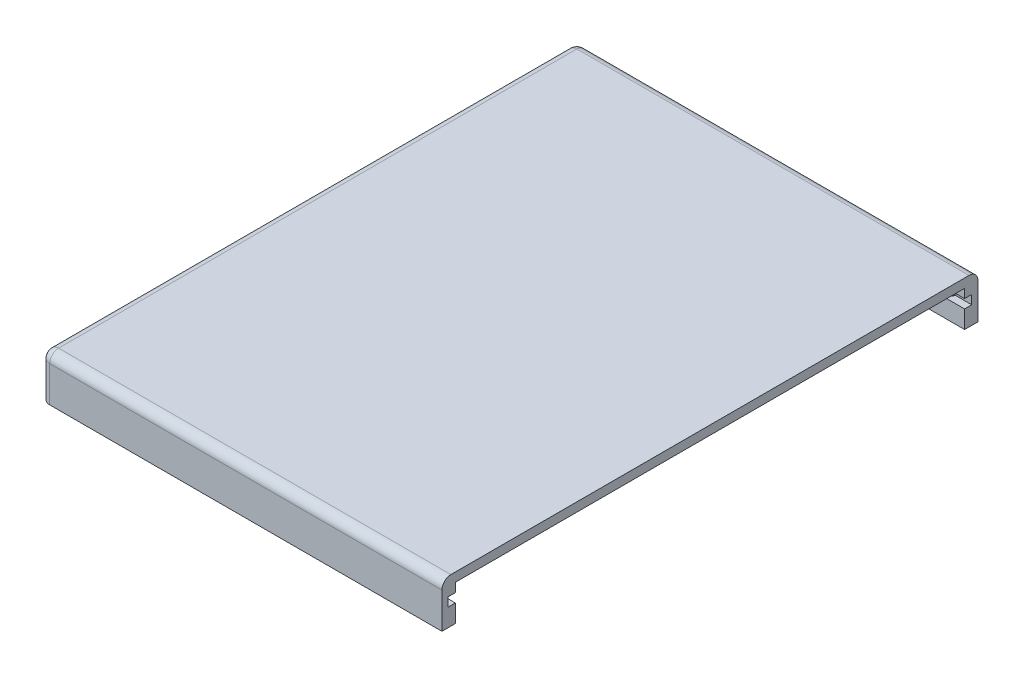
ISO-10303-21;
HEADER;
FILE_DESCRIPTION(('STEP AP214'),'2;1');
FILE_NAME('part.step','',(''),(''),'','','');
FILE_SCHEMA(('AUTOMOTIVE_DESIGN { 1 0 10303 214 1 1 1 1 }'));
ENDSEC;
DATA;
#1=APPLICATION_CONTEXT('core data for automotive mechanical design processes');
#2=APPLICATION_PROTOCOL_DEFINITION('international standard','automotive_design',2000,#1);
#3=PRODUCT_CONTEXT('',#1,'mechanical');
#4=PRODUCT('Part','Part','',(#3));
#5=PRODUCT_RELATED_PRODUCT_CATEGORY('part','',(#4));
#6=PRODUCT_DEFINITION_FORMATION('','',#4);
#7=PRODUCT_DEFINITION_CONTEXT('part definition',#1,'design');
#8=PRODUCT_DEFINITION('design','',#6,#7);
#9=PRODUCT_DEFINITION_SHAPE('','',#8);
#10=(LENGTH_UNIT() NAMED_UNIT(*) SI_UNIT(.MILLI.,.METRE.));
#11=(NAMED_UNIT(*) PLANE_ANGLE_UNIT() SI_UNIT($,.RADIAN.));
#12=(NAMED_UNIT(*) SI_UNIT($,.STERADIAN.) SOLID_ANGLE_UNIT());
#13=UNCERTAINTY_MEASURE_WITH_UNIT(LENGTH_MEASURE(1.E-05),#10,'distance_accuracy_value','');
#14=(GEOMETRIC_REPRESENTATION_CONTEXT(3) GLOBAL_UNCERTAINTY_ASSIGNED_CONTEXT((#13)) GLOBAL_UNIT_ASSIGNED_CONTEXT((#10,
#11,#12)) REPRESENTATION_CONTEXT('',''));
#15=CARTESIAN_POINT('',(0.,0.,0.));
#16=DIRECTION('',(0.,0.,1.));
#17=DIRECTION('',(1.,0.,0.));
#18=AXIS2_PLACEMENT_3D('',#15,#16,#17);
#19=CARTESIAN_POINT('',(0.,0.,-29.3));
#20=DIRECTION('',(0.,0.,1.));
#21=DIRECTION('',(1.,0.,0.));
#22=AXIS2_PLACEMENT_3D('',#19,#20,#21);
#23=PLANE('',#22);
#24=DIRECTION('',(0.,-1.,0.));
#25=VECTOR('',#24,1.);
#26=CARTESIAN_POINT('',(18.5356735589579,11.5,-29.3));
#27=LINE('',#26,#25);
#28=CARTESIAN_POINT('',(18.5356735589579,11.5,-29.3));
#29=VERTEX_POINT('',#28);
#30=CARTESIAN_POINT('',(18.5356735589579,10.5,-29.3));
#31=VERTEX_POINT('',#30);
#32=EDGE_CURVE('E242',#29,#31,#27,.T.);
#33=ORIENTED_EDGE('',*,*,#32,.T.);
#34=DIRECTION('',(1.,0.,0.));
#35=VECTOR('',#34,1.);
#36=CARTESIAN_POINT('',(-23.,10.5,-29.3));
#37=LINE('',#36,#35);
#38=CARTESIAN_POINT('',(20.4,10.5,-29.3));
#39=VERTEX_POINT('',#38);
#40=EDGE_CURVE('E239',#31,#39,#37,.T.);
#41=ORIENTED_EDGE('',*,*,#40,.T.);
#42=DIRECTION('',(0.,1.,0.));
#43=VECTOR('',#42,1.);
#44=CARTESIAN_POINT('',(20.4,11.5,-29.3));
#45=LINE('',#44,#43);
#46=CARTESIAN_POINT('',(20.4,11.5,-29.3));
#47=VERTEX_POINT('',#46);
#48=EDGE_CURVE('E238',#39,#47,#45,.T.);
#49=ORIENTED_EDGE('',*,*,#48,.T.);
#50=DIRECTION('',(-1.,0.,0.));
#51=VECTOR('',#50,1.);
#52=CARTESIAN_POINT('',(-23.,11.5,-29.3));
#53=LINE('',#52,#51);
#54=EDGE_CURVE('E301',#47,#29,#53,.T.);
#55=ORIENTED_EDGE('',*,*,#54,.T.);
#56=EDGE_LOOP('',(#33,#41,#49,#55));
#57=FACE_BOUND('',#56,.T.);
#58=ADVANCED_FACE('F39',(#57),#23,.T.);
#59=CARTESIAN_POINT('',(-23.,11.5,-29.3));
#60=DIRECTION('',(0.,1.,0.));
#61=DIRECTION('',(0.,0.,1.));
#62=AXIS2_PLACEMENT_3D('',#59,#60,#61);
#63=PLANE('',#62);
#64=CARTESIAN_POINT('',(17.0356735589579,11.5,-29.3));
#65=VERTEX_POINT('',#64);
#66=CARTESIAN_POINT('',(-23.8,11.5,-29.3));
#67=VERTEX_POINT('',#66);
#68=EDGE_CURVE('E300',#65,#67,#53,.T.);
#69=ORIENTED_EDGE('',*,*,#68,.F.);
#70=CARTESIAN_POINT('',(17.5356735589579,11.5,-29.3));
#71=DIRECTION('',(0.,1.,0.));
#72=DIRECTION('',(0.,0.,1.));
#73=AXIS2_PLACEMENT_3D('',#70,#71,#72);
#74=CIRCLE('',#73,0.5);
#75=CARTESIAN_POINT('',(17.5356735589579,11.5,-28.8));
#76=VERTEX_POINT('',#75);
#77=EDGE_CURVE('E47',#65,#76,#74,.T.);
#78=ORIENTED_EDGE('',*,*,#77,.T.);
#79=DIRECTION('',(1.,0.,0.));
#80=VECTOR('',#79,1.);
#81=CARTESIAN_POINT('',(18.5356735589579,11.5,-28.8));
#82=LINE('',#81,#80);
#83=CARTESIAN_POINT('',(18.0356735589579,11.5,-28.8));
#84=VERTEX_POINT('',#83);
#85=EDGE_CURVE('E241',#76,#84,#82,.T.);
#86=ORIENTED_EDGE('',*,*,#85,.T.);
#87=CARTESIAN_POINT('',(18.0356735589579,11.5,-29.3));
#88=DIRECTION('',(0.,1.,0.));
#89=DIRECTION('',(0.,0.,1.));
#90=AXIS2_PLACEMENT_3D('',#87,#88,#89);
#91=CIRCLE('',#90,0.5);
#92=EDGE_CURVE('E431',#84,#29,#91,.T.);
#93=ORIENTED_EDGE('',*,*,#92,.T.);
#94=ORIENTED_EDGE('',*,*,#54,.F.);
#95=DIRECTION('',(0.,0.,1.));
#96=VECTOR('',#95,1.);
#97=CARTESIAN_POINT('',(20.4,11.5,-29.3));
#98=LINE('',#97,#96);
#99=CARTESIAN_POINT('',(20.4,11.5,-28.5));
#100=VERTEX_POINT('',#99);
#101=EDGE_CURVE('E309',#47,#100,#98,.T.);
#102=ORIENTED_EDGE('',*,*,#101,.T.);
#103=DIRECTION('',(-1.,0.,0.));
#104=VECTOR('',#103,1.);
#105=CARTESIAN_POINT('',(-23.,11.5,-28.5));
#106=LINE('',#105,#104);
#107=CARTESIAN_POINT('',(-23.,11.5,-28.5));
#108=VERTEX_POINT('',#107);
#109=EDGE_CURVE('E306',#100,#108,#106,.T.);
#110=ORIENTED_EDGE('',*,*,#109,.T.);
#111=DIRECTION('',(0.,0.,1.));
#112=VECTOR('',#111,1.);
#113=CARTESIAN_POINT('',(-23.,11.5,29.3));
#114=LINE('',#113,#112);
#115=CARTESIAN_POINT('',(-23.,11.5,28.5));
#116=VERTEX_POINT('',#115);
#117=EDGE_CURVE('E267',#108,#116,#114,.T.);
#118=ORIENTED_EDGE('',*,*,#117,.T.);
#119=DIRECTION('',(1.,0.,0.));
#120=VECTOR('',#119,1.);
#121=CARTESIAN_POINT('',(20.4,11.5,28.5));
#122=LINE('',#121,#120);
#123=CARTESIAN_POINT('',(20.4,11.5,28.5));
#124=VERTEX_POINT('',#123);
#125=EDGE_CURVE('E282',#116,#124,#122,.T.);
#126=ORIENTED_EDGE('',*,*,#125,.T.);
#127=DIRECTION('',(0.,0.,-1.));
#128=VECTOR('',#127,1.);
#129=CARTESIAN_POINT('',(20.4,11.5,29.3));
#130=LINE('',#129,#128);
#131=CARTESIAN_POINT('',(20.4,11.5,29.3));
#132=VERTEX_POINT('',#131);
#133=EDGE_CURVE('E294',#132,#124,#130,.T.);
#134=ORIENTED_EDGE('',*,*,#133,.F.);
#135=DIRECTION('',(1.,0.,0.));
#136=VECTOR('',#135,1.);
#137=CARTESIAN_POINT('',(20.4,11.5,29.3));
#138=LINE('',#137,#136);
#139=CARTESIAN_POINT('',(18.5356735589579,11.5,29.3));
#140=VERTEX_POINT('',#139);
#141=EDGE_CURVE('E286',#140,#132,#138,.T.);
#142=ORIENTED_EDGE('',*,*,#141,.F.);
#143=CARTESIAN_POINT('',(18.0356735589579,11.5,29.3));
#144=DIRECTION('',(0.,1.,0.));
#145=DIRECTION('',(0.,0.,1.));
#146=AXIS2_PLACEMENT_3D('',#143,#144,#145);
#147=CIRCLE('',#146,0.5);
#148=CARTESIAN_POINT('',(18.0356735589579,11.5,28.8));
#149=VERTEX_POINT('',#148);
#150=EDGE_CURVE('E421',#140,#149,#147,.T.);
#151=ORIENTED_EDGE('',*,*,#150,.T.);
#152=DIRECTION('',(1.,0.,0.));
#153=VECTOR('',#152,1.);
#154=CARTESIAN_POINT('',(18.5356735589579,11.5,28.8));
#155=LINE('',#154,#153);
#156=CARTESIAN_POINT('',(17.5356735589579,11.5,28.8));
#157=VERTEX_POINT('',#156);
#158=EDGE_CURVE('E253',#157,#149,#155,.T.);
#159=ORIENTED_EDGE('',*,*,#158,.F.);
#160=CARTESIAN_POINT('',(17.5356735589579,11.5,29.3));
#161=DIRECTION('',(0.,1.,0.));
#162=DIRECTION('',(0.,0.,1.));
#163=AXIS2_PLACEMENT_3D('',#160,#161,#162);
#164=CIRCLE('',#163,0.5);
#165=CARTESIAN_POINT('',(17.0356735589579,11.5,29.3));
#166=VERTEX_POINT('',#165);
#167=EDGE_CURVE('E423',#157,#166,#164,.T.);
#168=ORIENTED_EDGE('',*,*,#167,.T.);
#169=CARTESIAN_POINT('',(-23.8,11.5,29.3));
#170=VERTEX_POINT('',#169);
#171=EDGE_CURVE('E287',#170,#166,#138,.T.);
#172=ORIENTED_EDGE('',*,*,#171,.F.);
#173=DIRECTION('',(0.,0.,1.));
#174=VECTOR('',#173,1.);
#175=CARTESIAN_POINT('',(-23.8,11.5,29.3));
#176=LINE('',#175,#174);
#177=EDGE_CURVE('E270',#67,#170,#176,.T.);
#178=ORIENTED_EDGE('',*,*,#177,.F.);
#179=EDGE_LOOP('',(#69,#78,#86,#93,#94,#102,#110,#118,#126,#134,#142,#151,#159,#168,#172,#178));
#180=FACE_BOUND('',#179,.T.);
#181=ADVANCED_FACE('F433',(#180),#63,.F.);
#182=CARTESIAN_POINT('',(-23.,10.5,-29.3));
#183=DIRECTION('',(0.,-1.,0.));
#184=DIRECTION('',(0.,0.,-1.));
#185=AXIS2_PLACEMENT_3D('',#182,#183,#184);
#186=PLANE('',#185);
#187=ORIENTED_EDGE('',*,*,#40,.F.);
#188=CARTESIAN_POINT('',(18.0356735589579,10.5,-29.3));
#189=DIRECTION('',(0.,-1.,0.));
#190=DIRECTION('',(0.,0.,-1.));
#191=AXIS2_PLACEMENT_3D('',#188,#189,#190);
#192=CIRCLE('',#191,0.5);
#193=CARTESIAN_POINT('',(18.0356735589579,10.5,-28.8));
#194=VERTEX_POINT('',#193);
#195=EDGE_CURVE('E61',#31,#194,#192,.T.);
#196=ORIENTED_EDGE('',*,*,#195,.T.);
#197=DIRECTION('',(-1.,0.,0.));
#198=VECTOR('',#197,1.);
#199=CARTESIAN_POINT('',(18.5356735589579,10.5,-28.8));
#200=LINE('',#199,#198);
#201=CARTESIAN_POINT('',(17.5356735589579,10.5,-28.8));
#202=VERTEX_POINT('',#201);
#203=EDGE_CURVE('E227',#194,#202,#200,.T.);
#204=ORIENTED_EDGE('',*,*,#203,.T.);
#205=CARTESIAN_POINT('',(17.5356735589579,10.5,-29.3));
#206=DIRECTION('',(0.,-1.,0.));
#207=DIRECTION('',(0.,0.,-1.));
#208=AXIS2_PLACEMENT_3D('',#205,#206,#207);
#209=CIRCLE('',#208,0.5);
#210=CARTESIAN_POINT('',(17.0356735589579,10.5,-29.3));
#211=VERTEX_POINT('',#210);
#212=EDGE_CURVE('E11',#202,#211,#209,.T.);
#213=ORIENTED_EDGE('',*,*,#212,.T.);
#214=CARTESIAN_POINT('',(-23.8,10.5,-29.3));
#215=VERTEX_POINT('',#214);
#216=EDGE_CURVE('E225',#215,#211,#37,.T.);
#217=ORIENTED_EDGE('',*,*,#216,.F.);
#218=DIRECTION('',(0.,0.,-1.));
#219=VECTOR('',#218,1.);
#220=CARTESIAN_POINT('',(-23.8,10.5,29.3));
#221=LINE('',#220,#219);
#222=CARTESIAN_POINT('',(-23.8,10.5,29.3));
#223=VERTEX_POINT('',#222);
#224=EDGE_CURVE('E266',#223,#215,#221,.T.);
#225=ORIENTED_EDGE('',*,*,#224,.F.);
#226=DIRECTION('',(-1.,0.,0.));
#227=VECTOR('',#226,1.);
#228=CARTESIAN_POINT('',(20.4,10.5,29.3));
#229=LINE('',#228,#227);
#230=CARTESIAN_POINT('',(17.0356735589579,10.5,29.3));
#231=VERTEX_POINT('',#230);
#232=EDGE_CURVE('E281',#231,#223,#229,.T.);
#233=ORIENTED_EDGE('',*,*,#232,.F.);
#234=CARTESIAN_POINT('',(17.5356735589579,10.5,29.3));
#235=DIRECTION('',(0.,-1.,0.));
#236=DIRECTION('',(0.,0.,-1.));
#237=AXIS2_PLACEMENT_3D('',#234,#235,#236);
#238=CIRCLE('',#237,0.5);
#239=CARTESIAN_POINT('',(17.5356735589579,10.5,28.8));
#240=VERTEX_POINT('',#239);
#241=EDGE_CURVE('E425',#231,#240,#238,.T.);
#242=ORIENTED_EDGE('',*,*,#241,.T.);
#243=DIRECTION('',(-1.,0.,0.));
#244=VECTOR('',#243,1.);
#245=CARTESIAN_POINT('',(18.5356735589579,10.5,28.8));
#246=LINE('',#245,#244);
#247=CARTESIAN_POINT('',(18.0356735589579,10.5,28.8));
#248=VERTEX_POINT('',#247);
#249=EDGE_CURVE('E250',#248,#240,#246,.T.);
#250=ORIENTED_EDGE('',*,*,#249,.F.);
#251=CARTESIAN_POINT('',(18.0356735589579,10.5,29.3));
#252=DIRECTION('',(0.,-1.,0.));
#253=DIRECTION('',(0.,0.,-1.));
#254=AXIS2_PLACEMENT_3D('',#251,#252,#253);
#255=CIRCLE('',#254,0.5);
#256=CARTESIAN_POINT('',(18.5356735589579,10.5,29.3));
#257=VERTEX_POINT('',#256);
#258=EDGE_CURVE('E419',#248,#257,#255,.T.);
#259=ORIENTED_EDGE('',*,*,#258,.T.);
#260=CARTESIAN_POINT('',(20.4,10.5,29.3));
#261=VERTEX_POINT('',#260);
#262=EDGE_CURVE('E283',#261,#257,#229,.T.);
#263=ORIENTED_EDGE('',*,*,#262,.F.);
#264=DIRECTION('',(0.,0.,-1.));
#265=VECTOR('',#264,1.);
#266=CARTESIAN_POINT('',(20.4,10.5,29.3));
#267=LINE('',#266,#265);
#268=CARTESIAN_POINT('',(20.4,10.5,28.5));
#269=VERTEX_POINT('',#268);
#270=EDGE_CURVE('E290',#261,#269,#267,.T.);
#271=ORIENTED_EDGE('',*,*,#270,.T.);
#272=DIRECTION('',(-1.,0.,0.));
#273=VECTOR('',#272,1.);
#274=CARTESIAN_POINT('',(20.4,10.5,28.5));
#275=LINE('',#274,#273);
#276=CARTESIAN_POINT('',(-23.,10.5,28.5));
#277=VERTEX_POINT('',#276);
#278=EDGE_CURVE('E273',#269,#277,#275,.T.);
#279=ORIENTED_EDGE('',*,*,#278,.T.);
#280=DIRECTION('',(0.,0.,-1.));
#281=VECTOR('',#280,1.);
#282=CARTESIAN_POINT('',(-23.,10.5,29.3));
#283=LINE('',#282,#281);
#284=CARTESIAN_POINT('',(-23.,10.5,-28.5));
#285=VERTEX_POINT('',#284);
#286=EDGE_CURVE('E274',#277,#285,#283,.T.);
#287=ORIENTED_EDGE('',*,*,#286,.T.);
#288=DIRECTION('',(1.,0.,0.));
#289=VECTOR('',#288,1.);
#290=CARTESIAN_POINT('',(-23.,10.5,-28.5));
#291=LINE('',#290,#289);
#292=CARTESIAN_POINT('',(20.4,10.5,-28.5));
#293=VERTEX_POINT('',#292);
#294=EDGE_CURVE('E297',#285,#293,#291,.T.);
#295=ORIENTED_EDGE('',*,*,#294,.T.);
#296=DIRECTION('',(0.,0.,1.));
#297=VECTOR('',#296,1.);
#298=CARTESIAN_POINT('',(20.4,10.5,-29.3));
#299=LINE('',#298,#297);
#300=EDGE_CURVE('E304',#39,#293,#299,.T.);
#301=ORIENTED_EDGE('',*,*,#300,.F.);
#302=EDGE_LOOP('',(#187,#196,#204,#213,#217,#225,#233,#242,#250,#259,#263,#271,#279,#287,#295,#301));
#303=FACE_BOUND('',#302,.T.);
#304=ADVANCED_FACE('F223',(#303),#186,.F.);
#305=CARTESIAN_POINT('',(0.,0.,29.3));
#306=DIRECTION('',(0.,0.,-1.));
#307=DIRECTION('',(-1.,0.,0.));
#308=AXIS2_PLACEMENT_3D('',#305,#306,#307);
#309=PLANE('',#308);
#310=ORIENTED_EDGE('',*,*,#262,.T.);
#311=DIRECTION('',(0.,-1.,0.));
#312=VECTOR('',#311,1.);
#313=CARTESIAN_POINT('',(18.5356735589579,11.5,29.3));
#314=LINE('',#313,#312);
#315=EDGE_CURVE('E258',#140,#257,#314,.T.);
#316=ORIENTED_EDGE('',*,*,#315,.F.);
#317=ORIENTED_EDGE('',*,*,#141,.T.);
#318=DIRECTION('',(0.,-1.,0.));
#319=VECTOR('',#318,1.);
#320=CARTESIAN_POINT('',(20.4,11.5,29.3));
#321=LINE('',#320,#319);
#322=EDGE_CURVE('E278',#132,#261,#321,.T.);
#323=ORIENTED_EDGE('',*,*,#322,.T.);
#324=EDGE_LOOP('',(#310,#316,#317,#323));
#325=FACE_BOUND('',#324,.T.);
#326=ADVANCED_FACE('F505',(#325),#309,.T.);
#327=ORIENTED_EDGE('',*,*,#171,.T.);
#328=DIRECTION('',(0.,1.,0.));
#329=VECTOR('',#328,1.);
#330=CARTESIAN_POINT('',(17.0356735589579,11.5,29.3));
#331=LINE('',#330,#329);
#332=EDGE_CURVE('E254',#231,#166,#331,.T.);
#333=ORIENTED_EDGE('',*,*,#332,.F.);
#334=ORIENTED_EDGE('',*,*,#232,.T.);
#335=DIRECTION('',(0.,-1.,0.));
#336=VECTOR('',#335,1.);
#337=CARTESIAN_POINT('',(-23.8,11.5,29.3));
#338=LINE('',#337,#336);
#339=EDGE_CURVE('E263',#170,#223,#338,.T.);
#340=ORIENTED_EDGE('',*,*,#339,.F.);
#341=EDGE_LOOP('',(#327,#333,#334,#340));
#342=FACE_BOUND('',#341,.T.);
#343=ADVANCED_FACE('F483',(#342),#309,.T.);
#344=CARTESIAN_POINT('',(-23.,12.5,0.));
#345=DIRECTION('',(-1.,0.,0.));
#346=DIRECTION('',(0.,0.,1.));
#347=AXIS2_PLACEMENT_3D('',#344,#345,#346);
#348=PLANE('',#347);
#349=DIRECTION('',(0.,-1.,0.));
#350=VECTOR('',#349,1.);
#351=CARTESIAN_POINT('',(-23.,12.5,28.5));
#352=LINE('',#351,#350);
#353=CARTESIAN_POINT('',(-23.,12.5,28.5));
#354=VERTEX_POINT('',#353);
#355=EDGE_CURVE('E338',#354,#116,#352,.T.);
#356=ORIENTED_EDGE('',*,*,#355,.T.);
#357=ORIENTED_EDGE('',*,*,#117,.F.);
#358=DIRECTION('',(0.,-1.,0.));
#359=VECTOR('',#358,1.);
#360=CARTESIAN_POINT('',(-23.,12.5,-28.5));
#361=LINE('',#360,#359);
#362=CARTESIAN_POINT('',(-23.,12.5,-28.5));
#363=VERTEX_POINT('',#362);
#364=EDGE_CURVE('E342',#363,#108,#361,.T.);
#365=ORIENTED_EDGE('',*,*,#364,.F.);
#366=DIRECTION('',(0.,0.,-1.));
#367=VECTOR('',#366,1.);
#368=CARTESIAN_POINT('',(-23.,12.5,0.));
#369=LINE('',#368,#367);
#370=EDGE_CURVE('E320',#354,#363,#369,.T.);
#371=ORIENTED_EDGE('',*,*,#370,.F.);
#372=EDGE_LOOP('',(#356,#357,#365,#371));
#373=FACE_BOUND('',#372,.T.);
#374=ADVANCED_FACE('F457',(#373),#348,.F.);
#375=CARTESIAN_POINT('',(0.,12.5,28.5));
#376=DIRECTION('',(0.,0.,1.));
#377=DIRECTION('',(1.,0.,0.));
#378=AXIS2_PLACEMENT_3D('',#375,#376,#377);
#379=PLANE('',#378);
#380=DIRECTION('',(0.,-1.,0.));
#381=VECTOR('',#380,1.);
#382=CARTESIAN_POINT('',(20.4,12.5,28.5));
#383=LINE('',#382,#381);
#384=CARTESIAN_POINT('',(20.4,12.5,28.5));
#385=VERTEX_POINT('',#384);
#386=EDGE_CURVE('E334',#385,#124,#383,.T.);
#387=ORIENTED_EDGE('',*,*,#386,.T.);
#388=ORIENTED_EDGE('',*,*,#125,.F.);
#389=ORIENTED_EDGE('',*,*,#355,.F.);
#390=DIRECTION('',(-1.,0.,0.));
#391=VECTOR('',#390,1.);
#392=CARTESIAN_POINT('',(0.,12.5,28.5));
#393=LINE('',#392,#391);
#394=EDGE_CURVE('E323',#385,#354,#393,.T.);
#395=ORIENTED_EDGE('',*,*,#394,.F.);
#396=EDGE_LOOP('',(#387,#388,#389,#395));
#397=FACE_BOUND('',#396,.T.);
#398=ADVANCED_FACE('F461',(#397),#379,.F.);
#399=CARTESIAN_POINT('',(0.,12.5,-28.5));
#400=DIRECTION('',(0.,0.,-1.));
#401=DIRECTION('',(-1.,0.,0.));
#402=AXIS2_PLACEMENT_3D('',#399,#400,#401);
#403=PLANE('',#402);
#404=ORIENTED_EDGE('',*,*,#364,.T.);
#405=ORIENTED_EDGE('',*,*,#109,.F.);
#406=DIRECTION('',(0.,-1.,0.));
#407=VECTOR('',#406,1.);
#408=CARTESIAN_POINT('',(20.4,12.5,-28.5));
#409=LINE('',#408,#407);
#410=CARTESIAN_POINT('',(20.4,12.5,-28.5));
#411=VERTEX_POINT('',#410);
#412=EDGE_CURVE('E346',#411,#100,#409,.T.);
#413=ORIENTED_EDGE('',*,*,#412,.F.);
#414=DIRECTION('',(1.,0.,0.));
#415=VECTOR('',#414,1.);
#416=CARTESIAN_POINT('',(0.,12.5,-28.5));
#417=LINE('',#416,#415);
#418=EDGE_CURVE('E316',#363,#411,#417,.T.);
#419=ORIENTED_EDGE('',*,*,#418,.F.);
#420=EDGE_LOOP('',(#404,#405,#413,#419));
#421=FACE_BOUND('',#420,.T.);
#422=ADVANCED_FACE('F453',(#421),#403,.F.);
#423=CARTESIAN_POINT('',(20.4,13.5,0.));
#424=DIRECTION('',(1.,0.,0.));
#425=DIRECTION('',(0.,0.,-1.));
#426=AXIS2_PLACEMENT_3D('',#423,#424,#425);
#427=PLANE('',#426);
#428=DIRECTION('',(0.,-1.,0.));
#429=VECTOR('',#428,1.);
#430=CARTESIAN_POINT('',(20.4,13.5,-30.));
#431=LINE('',#430,#429);
#432=CARTESIAN_POINT('',(20.4,12.5,-30.));
#433=VERTEX_POINT('',#432);
#434=CARTESIAN_POINT('',(20.4,8.5,-30.));
#435=VERTEX_POINT('',#434);
#436=EDGE_CURVE('E381',#433,#435,#431,.T.);
#437=ORIENTED_EDGE('',*,*,#436,.F.);
#438=CARTESIAN_POINT('',(20.4,12.5,-29.));
#439=DIRECTION('',(1.,0.,0.));
#440=DIRECTION('',(0.,0.,-1.));
#441=AXIS2_PLACEMENT_3D('',#438,#439,#440);
#442=CIRCLE('',#441,1.);
#443=CARTESIAN_POINT('',(20.4,13.5,-29.));
#444=VERTEX_POINT('',#443);
#445=EDGE_CURVE('E398',#433,#444,#442,.T.);
#446=ORIENTED_EDGE('',*,*,#445,.T.);
#447=DIRECTION('',(0.,0.,1.));
#448=VECTOR('',#447,1.);
#449=CARTESIAN_POINT('',(20.4,13.5,0.));
#450=LINE('',#449,#448);
#451=CARTESIAN_POINT('',(20.4,13.5,29.));
#452=VERTEX_POINT('',#451);
#453=EDGE_CURVE('E350',#444,#452,#450,.T.);
#454=ORIENTED_EDGE('',*,*,#453,.T.);
#455=CARTESIAN_POINT('',(20.4,12.5,29.));
#456=DIRECTION('',(1.,0.,0.));
#457=DIRECTION('',(0.,0.,-1.));
#458=AXIS2_PLACEMENT_3D('',#455,#456,#457);
#459=CIRCLE('',#458,1.);
#460=CARTESIAN_POINT('',(20.4,12.5,30.));
#461=VERTEX_POINT('',#460);
#462=EDGE_CURVE('E396',#452,#461,#459,.T.);
#463=ORIENTED_EDGE('',*,*,#462,.T.);
#464=DIRECTION('',(0.,-1.,0.));
#465=VECTOR('',#464,1.);
#466=CARTESIAN_POINT('',(20.4,13.5,30.));
#467=LINE('',#466,#465);
#468=CARTESIAN_POINT('',(20.4,8.5,30.));
#469=VERTEX_POINT('',#468);
#470=EDGE_CURVE('E353',#461,#469,#467,.T.);
#471=ORIENTED_EDGE('',*,*,#470,.T.);
#472=DIRECTION('',(0.,0.,1.));
#473=VECTOR('',#472,1.);
#474=CARTESIAN_POINT('',(20.4,8.5,0.));
#475=LINE('',#474,#473);
#476=CARTESIAN_POINT('',(20.4,8.5,28.5));
#477=VERTEX_POINT('',#476);
#478=EDGE_CURVE('E349',#477,#469,#475,.T.);
#479=ORIENTED_EDGE('',*,*,#478,.F.);
#480=EDGE_CURVE('E326',#269,#477,#383,.T.);
#481=ORIENTED_EDGE('',*,*,#480,.F.);
#482=ORIENTED_EDGE('',*,*,#270,.F.);
#483=ORIENTED_EDGE('',*,*,#322,.F.);
#484=ORIENTED_EDGE('',*,*,#133,.T.);
#485=ORIENTED_EDGE('',*,*,#386,.F.);
#486=DIRECTION('',(0.,0.,1.));
#487=VECTOR('',#486,1.);
#488=CARTESIAN_POINT('',(20.4,12.5,0.));
#489=LINE('',#488,#487);
#490=EDGE_CURVE('E314',#411,#385,#489,.T.);
#491=ORIENTED_EDGE('',*,*,#490,.F.);
#492=ORIENTED_EDGE('',*,*,#412,.T.);
#493=ORIENTED_EDGE('',*,*,#101,.F.);
#494=ORIENTED_EDGE('',*,*,#48,.F.);
#495=ORIENTED_EDGE('',*,*,#300,.T.);
#496=CARTESIAN_POINT('',(20.4,8.5,-28.5));
#497=VERTEX_POINT('',#496);
#498=EDGE_CURVE('E345',#293,#497,#409,.T.);
#499=ORIENTED_EDGE('',*,*,#498,.T.);
#500=EDGE_CURVE('E355',#435,#497,#475,.T.);
#501=ORIENTED_EDGE('',*,*,#500,.F.);
#502=EDGE_LOOP('',(#437,#446,#454,#463,#471,#479,#481,#482,#483,#484,#485,#491,#492,#493,#494,
#495,#499,#501));
#503=FACE_BOUND('',#502,.T.);
#504=ADVANCED_FACE('F448',(#503),#427,.T.);
#505=CARTESIAN_POINT('',(0.,13.5,-30.));
#506=DIRECTION('',(0.,0.,1.));
#507=DIRECTION('',(1.,0.,0.));
#508=AXIS2_PLACEMENT_3D('',#505,#506,#507);
#509=PLANE('',#508);
#510=DIRECTION('',(0.,-1.,0.));
#511=VECTOR('',#510,1.);
#512=CARTESIAN_POINT('',(-23.5,13.5,-30.));
#513=LINE('',#512,#511);
#514=CARTESIAN_POINT('',(-23.5,12.5,-30.));
#515=VERTEX_POINT('',#514);
#516=CARTESIAN_POINT('',(-23.5,8.5,-30.));
#517=VERTEX_POINT('',#516);
#518=EDGE_CURVE('E379',#515,#517,#513,.T.);
#519=ORIENTED_EDGE('',*,*,#518,.F.);
#520=DIRECTION('',(-1.,0.,0.));
#521=VECTOR('',#520,1.);
#522=CARTESIAN_POINT('',(20.4,12.5,-30.));
#523=LINE('',#522,#521);
#524=EDGE_CURVE('E394',#515,#433,#523,.F.);
#525=ORIENTED_EDGE('',*,*,#524,.T.);
#526=ORIENTED_EDGE('',*,*,#436,.T.);
#527=DIRECTION('',(-1.,0.,0.));
#528=VECTOR('',#527,1.);
#529=CARTESIAN_POINT('',(0.,8.5,-30.));
#530=LINE('',#529,#528);
#531=EDGE_CURVE('E358',#435,#517,#530,.T.);
#532=ORIENTED_EDGE('',*,*,#531,.T.);
#533=EDGE_LOOP('',(#519,#525,#526,#532));
#534=FACE_BOUND('',#533,.T.);
#535=ADVANCED_FACE('F547',(#534),#509,.F.);
#536=CARTESIAN_POINT('',(-23.5,13.5,-29.));
#537=DIRECTION('',(0.,-1.,0.));
#538=DIRECTION('',(0.,0.,-1.));
#539=AXIS2_PLACEMENT_3D('',#536,#537,#538);
#540=CYLINDRICAL_SURFACE('',#539,1.);
#541=DIRECTION('',(0.,-1.,0.));
#542=VECTOR('',#541,1.);
#543=CARTESIAN_POINT('',(-24.5,13.5,-29.));
#544=LINE('',#543,#542);
#545=CARTESIAN_POINT('',(-24.5,12.5,-29.));
#546=VERTEX_POINT('',#545);
#547=CARTESIAN_POINT('',(-24.5,8.5,-29.));
#548=VERTEX_POINT('',#547);
#549=EDGE_CURVE('E377',#546,#548,#544,.T.);
#550=ORIENTED_EDGE('',*,*,#549,.F.);
#551=CARTESIAN_POINT('',(-23.5,12.5,-29.));
#552=DIRECTION('',(0.,-1.,0.));
#553=DIRECTION('',(0.,0.,-1.));
#554=AXIS2_PLACEMENT_3D('',#551,#552,#553);
#555=CIRCLE('',#554,1.);
#556=EDGE_CURVE('E383',#546,#515,#555,.T.);
#557=ORIENTED_EDGE('',*,*,#556,.T.);
#558=ORIENTED_EDGE('',*,*,#518,.T.);
#559=CARTESIAN_POINT('',(-23.5,8.5,-29.));
#560=DIRECTION('',(0.,1.,0.));
#561=DIRECTION('',(0.,0.,1.));
#562=AXIS2_PLACEMENT_3D('',#559,#560,#561);
#563=CIRCLE('',#562,1.);
#564=EDGE_CURVE('E361',#517,#548,#563,.T.);
#565=ORIENTED_EDGE('',*,*,#564,.T.);
#566=EDGE_LOOP('',(#550,#557,#558,#565));
#567=FACE_BOUND('',#566,.T.);
#568=ADVANCED_FACE('F543',(#567),#540,.T.);
#569=CARTESIAN_POINT('',(-24.5,13.5,0.));
#570=DIRECTION('',(1.,0.,0.));
#571=DIRECTION('',(0.,0.,-1.));
#572=AXIS2_PLACEMENT_3D('',#569,#570,#571);
#573=PLANE('',#572);
#574=DIRECTION('',(0.,-1.,0.));
#575=VECTOR('',#574,1.);
#576=CARTESIAN_POINT('',(-24.5,13.5,29.));
#577=LINE('',#576,#575);
#578=CARTESIAN_POINT('',(-24.5,12.5,29.));
#579=VERTEX_POINT('',#578);
#580=CARTESIAN_POINT('',(-24.5,8.5,29.));
#581=VERTEX_POINT('',#580);
#582=EDGE_CURVE('E375',#579,#581,#577,.T.);
#583=ORIENTED_EDGE('',*,*,#582,.F.);
#584=DIRECTION('',(0.,0.,1.));
#585=VECTOR('',#584,1.);
#586=CARTESIAN_POINT('',(-24.5,12.5,-29.));
#587=LINE('',#586,#585);
#588=EDGE_CURVE('E400',#579,#546,#587,.F.);
#589=ORIENTED_EDGE('',*,*,#588,.T.);
#590=ORIENTED_EDGE('',*,*,#549,.T.);
#591=DIRECTION('',(0.,0.,1.));
#592=VECTOR('',#591,1.);
#593=CARTESIAN_POINT('',(-24.5,8.5,0.));
#594=LINE('',#593,#592);
#595=EDGE_CURVE('E364',#548,#581,#594,.T.);
#596=ORIENTED_EDGE('',*,*,#595,.T.);
#597=EDGE_LOOP('',(#583,#589,#590,#596));
#598=FACE_BOUND('',#597,.T.);
#599=ADVANCED_FACE('F539',(#598),#573,.F.);
#600=CARTESIAN_POINT('',(-23.5,13.5,29.));
#601=DIRECTION('',(0.,-1.,0.));
#602=DIRECTION('',(0.,0.,-1.));
#603=AXIS2_PLACEMENT_3D('',#600,#601,#602);
#604=CYLINDRICAL_SURFACE('',#603,1.);
#605=DIRECTION('',(0.,-1.,0.));
#606=VECTOR('',#605,1.);
#607=CARTESIAN_POINT('',(-23.5,13.5,30.));
#608=LINE('',#607,#606);
#609=CARTESIAN_POINT('',(-23.5,12.5,30.));
#610=VERTEX_POINT('',#609);
#611=CARTESIAN_POINT('',(-23.5,8.5,30.));
#612=VERTEX_POINT('',#611);
#613=EDGE_CURVE('E373',#610,#612,#608,.T.);
#614=ORIENTED_EDGE('',*,*,#613,.F.);
#615=CARTESIAN_POINT('',(-23.5,12.5,29.));
#616=DIRECTION('',(0.,-1.,0.));
#617=DIRECTION('',(0.,0.,-1.));
#618=AXIS2_PLACEMENT_3D('',#615,#616,#617);
#619=CIRCLE('',#618,1.);
#620=EDGE_CURVE('E386',#610,#579,#619,.T.);
#621=ORIENTED_EDGE('',*,*,#620,.T.);
#622=ORIENTED_EDGE('',*,*,#582,.T.);
#623=CARTESIAN_POINT('',(-23.5,8.5,29.));
#624=DIRECTION('',(0.,1.,0.));
#625=DIRECTION('',(0.,0.,1.));
#626=AXIS2_PLACEMENT_3D('',#623,#624,#625);
#627=CIRCLE('',#626,1.);
#628=EDGE_CURVE('E367',#581,#612,#627,.T.);
#629=ORIENTED_EDGE('',*,*,#628,.T.);
#630=EDGE_LOOP('',(#614,#621,#622,#629));
#631=FACE_BOUND('',#630,.T.);
#632=ADVANCED_FACE('F535',(#631),#604,.T.);
#633=CARTESIAN_POINT('',(0.,13.5,30.));
#634=DIRECTION('',(0.,0.,-1.));
#635=DIRECTION('',(-1.,0.,0.));
#636=AXIS2_PLACEMENT_3D('',#633,#634,#635);
#637=PLANE('',#636);
#638=ORIENTED_EDGE('',*,*,#470,.F.);
#639=DIRECTION('',(1.,0.,0.));
#640=VECTOR('',#639,1.);
#641=CARTESIAN_POINT('',(-23.5,12.5,30.));
#642=LINE('',#641,#640);
#643=EDGE_CURVE('E402',#461,#610,#642,.F.);
#644=ORIENTED_EDGE('',*,*,#643,.T.);
#645=ORIENTED_EDGE('',*,*,#613,.T.);
#646=DIRECTION('',(1.,0.,0.));
#647=VECTOR('',#646,1.);
#648=CARTESIAN_POINT('',(0.,8.5,30.));
#649=LINE('',#648,#647);
#650=EDGE_CURVE('E354',#612,#469,#649,.T.);
#651=ORIENTED_EDGE('',*,*,#650,.T.);
#652=EDGE_LOOP('',(#638,#644,#645,#651));
#653=FACE_BOUND('',#652,.T.);
#654=ADVANCED_FACE('F528',(#653),#637,.F.);
#655=CARTESIAN_POINT('',(0.,13.5,0.));
#656=DIRECTION('',(0.,1.,0.));
#657=DIRECTION('',(0.,0.,1.));
#658=AXIS2_PLACEMENT_3D('',#655,#656,#657);
#659=PLANE('',#658);
#660=ORIENTED_EDGE('',*,*,#453,.F.);
#661=DIRECTION('',(-1.,0.,0.));
#662=VECTOR('',#661,1.);
#663=CARTESIAN_POINT('',(-23.5,13.5,-29.));
#664=LINE('',#663,#662);
#665=CARTESIAN_POINT('',(-23.5,13.5,-29.));
#666=VERTEX_POINT('',#665);
#667=EDGE_CURVE('E392',#444,#666,#664,.T.);
#668=ORIENTED_EDGE('',*,*,#667,.T.);
#669=DIRECTION('',(0.,0.,1.));
#670=VECTOR('',#669,1.);
#671=CARTESIAN_POINT('',(-23.5,13.5,29.));
#672=LINE('',#671,#670);
#673=CARTESIAN_POINT('',(-23.5,13.5,29.));
#674=VERTEX_POINT('',#673);
#675=EDGE_CURVE('E390',#666,#674,#672,.T.);
#676=ORIENTED_EDGE('',*,*,#675,.T.);
#677=DIRECTION('',(1.,0.,0.));
#678=VECTOR('',#677,1.);
#679=CARTESIAN_POINT('',(20.4,13.5,29.));
#680=LINE('',#679,#678);
#681=EDGE_CURVE('E388',#674,#452,#680,.T.);
#682=ORIENTED_EDGE('',*,*,#681,.T.);
#683=EDGE_LOOP('',(#660,#668,#676,#682));
#684=FACE_BOUND('',#683,.T.);
#685=ADVANCED_FACE('F525',(#684),#659,.T.);
#686=CARTESIAN_POINT('',(0.,8.5,0.));
#687=DIRECTION('',(0.,1.,0.));
#688=DIRECTION('',(0.,0.,1.));
#689=AXIS2_PLACEMENT_3D('',#686,#687,#688);
#690=PLANE('',#689);
#691=ORIENTED_EDGE('',*,*,#500,.T.);
#692=DIRECTION('',(1.,0.,0.));
#693=VECTOR('',#692,1.);
#694=CARTESIAN_POINT('',(0.,8.5,-28.5));
#695=LINE('',#694,#693);
#696=CARTESIAN_POINT('',(-23.,8.5,-28.5));
#697=VERTEX_POINT('',#696);
#698=EDGE_CURVE('E311',#697,#497,#695,.T.);
#699=ORIENTED_EDGE('',*,*,#698,.F.);
#700=DIRECTION('',(0.,0.,-1.));
#701=VECTOR('',#700,1.);
#702=CARTESIAN_POINT('',(-23.,8.5,0.));
#703=LINE('',#702,#701);
#704=CARTESIAN_POINT('',(-23.,8.5,28.5));
#705=VERTEX_POINT('',#704);
#706=EDGE_CURVE('E329',#705,#697,#703,.T.);
#707=ORIENTED_EDGE('',*,*,#706,.F.);
#708=DIRECTION('',(-1.,0.,0.));
#709=VECTOR('',#708,1.);
#710=CARTESIAN_POINT('',(0.,8.5,28.5));
#711=LINE('',#710,#709);
#712=EDGE_CURVE('E317',#477,#705,#711,.T.);
#713=ORIENTED_EDGE('',*,*,#712,.F.);
#714=ORIENTED_EDGE('',*,*,#478,.T.);
#715=ORIENTED_EDGE('',*,*,#650,.F.);
#716=ORIENTED_EDGE('',*,*,#628,.F.);
#717=ORIENTED_EDGE('',*,*,#595,.F.);
#718=ORIENTED_EDGE('',*,*,#564,.F.);
#719=ORIENTED_EDGE('',*,*,#531,.F.);
#720=EDGE_LOOP('',(#691,#699,#707,#713,#714,#715,#716,#717,#718,#719));
#721=FACE_BOUND('',#720,.T.);
#722=ADVANCED_FACE('F523',(#721),#690,.F.);
#723=ORIENTED_EDGE('',*,*,#498,.F.);
#724=ORIENTED_EDGE('',*,*,#294,.F.);
#725=EDGE_CURVE('E341',#285,#697,#361,.T.);
#726=ORIENTED_EDGE('',*,*,#725,.T.);
#727=ORIENTED_EDGE('',*,*,#698,.T.);
#728=EDGE_LOOP('',(#723,#724,#726,#727));
#729=FACE_BOUND('',#728,.T.);
#730=ADVANCED_FACE('F519',(#729),#403,.F.);
#731=ORIENTED_EDGE('',*,*,#725,.F.);
#732=ORIENTED_EDGE('',*,*,#286,.F.);
#733=EDGE_CURVE('E337',#277,#705,#352,.T.);
#734=ORIENTED_EDGE('',*,*,#733,.T.);
#735=ORIENTED_EDGE('',*,*,#706,.T.);
#736=EDGE_LOOP('',(#731,#732,#734,#735));
#737=FACE_BOUND('',#736,.T.);
#738=ADVANCED_FACE('F515',(#737),#348,.F.);
#739=ORIENTED_EDGE('',*,*,#733,.F.);
#740=ORIENTED_EDGE('',*,*,#278,.F.);
#741=ORIENTED_EDGE('',*,*,#480,.T.);
#742=ORIENTED_EDGE('',*,*,#712,.T.);
#743=EDGE_LOOP('',(#739,#740,#741,#742));
#744=FACE_BOUND('',#743,.T.);
#745=ADVANCED_FACE('F511',(#744),#379,.F.);
#746=CARTESIAN_POINT('',(0.,12.5,0.));
#747=DIRECTION('',(0.,1.,0.));
#748=DIRECTION('',(0.,0.,1.));
#749=AXIS2_PLACEMENT_3D('',#746,#747,#748);
#750=PLANE('',#749);
#751=ORIENTED_EDGE('',*,*,#490,.T.);
#752=ORIENTED_EDGE('',*,*,#394,.T.);
#753=ORIENTED_EDGE('',*,*,#370,.T.);
#754=ORIENTED_EDGE('',*,*,#418,.T.);
#755=EDGE_LOOP('',(#751,#752,#753,#754));
#756=FACE_BOUND('',#755,.T.);
#757=ADVANCED_FACE('F496',(#756),#750,.F.);
#758=DIRECTION('',(0.,1.,0.));
#759=VECTOR('',#758,1.);
#760=CARTESIAN_POINT('',(17.0356735589579,11.5,-29.3));
#761=LINE('',#760,#759);
#762=EDGE_CURVE('E233',#211,#65,#761,.T.);
#763=ORIENTED_EDGE('',*,*,#762,.T.);
#764=ORIENTED_EDGE('',*,*,#68,.T.);
#765=DIRECTION('',(0.,1.,0.));
#766=VECTOR('',#765,1.);
#767=CARTESIAN_POINT('',(-23.8,11.5,-29.3));
#768=LINE('',#767,#766);
#769=EDGE_CURVE('E236',#215,#67,#768,.T.);
#770=ORIENTED_EDGE('',*,*,#769,.F.);
#771=ORIENTED_EDGE('',*,*,#216,.T.);
#772=EDGE_LOOP('',(#763,#764,#770,#771));
#773=FACE_BOUND('',#772,.T.);
#774=ADVANCED_FACE('F232',(#773),#23,.T.);
#775=CARTESIAN_POINT('',(-23.8,0.,0.));
#776=DIRECTION('',(1.,0.,0.));
#777=DIRECTION('',(0.,0.,-1.));
#778=AXIS2_PLACEMENT_3D('',#775,#776,#777);
#779=PLANE('',#778);
#780=ORIENTED_EDGE('',*,*,#339,.T.);
#781=ORIENTED_EDGE('',*,*,#224,.T.);
#782=ORIENTED_EDGE('',*,*,#769,.T.);
#783=ORIENTED_EDGE('',*,*,#177,.T.);
#784=EDGE_LOOP('',(#780,#781,#782,#783));
#785=FACE_BOUND('',#784,.T.);
#786=ADVANCED_FACE('F485',(#785),#779,.T.);
#787=CARTESIAN_POINT('',(0.,12.5,29.));
#788=DIRECTION('',(-1.,0.,0.));
#789=DIRECTION('',(0.,0.,1.));
#790=AXIS2_PLACEMENT_3D('',#787,#788,#789);
#791=CYLINDRICAL_SURFACE('',#790,1.);
#792=CARTESIAN_POINT('',(-23.5,12.5,29.));
#793=DIRECTION('',(-1.,0.,0.));
#794=DIRECTION('',(0.,-1.,0.));
#795=AXIS2_PLACEMENT_3D('',#792,#793,#794);
#796=CIRCLE('',#795,1.);
#797=EDGE_CURVE('E276',#610,#674,#796,.T.);
#798=ORIENTED_EDGE('',*,*,#797,.F.);
#799=ORIENTED_EDGE('',*,*,#643,.F.);
#800=ORIENTED_EDGE('',*,*,#462,.F.);
#801=ORIENTED_EDGE('',*,*,#681,.F.);
#802=EDGE_LOOP('',(#798,#799,#800,#801));
#803=FACE_BOUND('',#802,.T.);
#804=ADVANCED_FACE('F487',(#803),#791,.T.);
#805=CARTESIAN_POINT('',(-23.5,12.5,29.));
#806=DIRECTION('',(0.,1.,0.));
#807=DIRECTION('',(0.,0.,1.));
#808=AXIS2_PLACEMENT_3D('',#805,#806,#807);
#809=SPHERICAL_SURFACE('',#808,1.);
#810=ORIENTED_EDGE('',*,*,#620,.F.);
#811=ORIENTED_EDGE('',*,*,#797,.T.);
#812=CARTESIAN_POINT('',(-23.5,12.5,29.));
#813=DIRECTION('',(0.,0.,-1.));
#814=DIRECTION('',(-1.,0.,0.));
#815=AXIS2_PLACEMENT_3D('',#812,#813,#814);
#816=CIRCLE('',#815,1.);
#817=EDGE_CURVE('E409',#579,#674,#816,.T.);
#818=ORIENTED_EDGE('',*,*,#817,.F.);
#819=EDGE_LOOP('',(#810,#811,#818));
#820=FACE_BOUND('',#819,.T.);
#821=ADVANCED_FACE('F493',(#820),#809,.T.);
#822=CARTESIAN_POINT('',(0.,12.5,-29.));
#823=DIRECTION('',(1.,0.,0.));
#824=DIRECTION('',(0.,0.,-1.));
#825=AXIS2_PLACEMENT_3D('',#822,#823,#824);
#826=CYLINDRICAL_SURFACE('',#825,1.);
#827=ORIENTED_EDGE('',*,*,#445,.F.);
#828=ORIENTED_EDGE('',*,*,#524,.F.);
#829=CARTESIAN_POINT('',(-23.5,12.5,-29.));
#830=DIRECTION('',(-1.,0.,0.));
#831=DIRECTION('',(0.,0.,1.));
#832=AXIS2_PLACEMENT_3D('',#829,#830,#831);
#833=CIRCLE('',#832,1.);
#834=EDGE_CURVE('E407',#666,#515,#833,.T.);
#835=ORIENTED_EDGE('',*,*,#834,.F.);
#836=ORIENTED_EDGE('',*,*,#667,.F.);
#837=EDGE_LOOP('',(#827,#828,#835,#836));
#838=FACE_BOUND('',#837,.T.);
#839=ADVANCED_FACE('F561',(#838),#826,.T.);
#840=CARTESIAN_POINT('',(-23.5,12.5,0.));
#841=DIRECTION('',(0.,0.,-1.));
#842=DIRECTION('',(-1.,0.,0.));
#843=AXIS2_PLACEMENT_3D('',#840,#841,#842);
#844=CYLINDRICAL_SURFACE('',#843,1.);
#845=ORIENTED_EDGE('',*,*,#817,.T.);
#846=ORIENTED_EDGE('',*,*,#675,.F.);
#847=CARTESIAN_POINT('',(-23.5,12.5,-29.));
#848=DIRECTION('',(0.,0.,-1.));
#849=DIRECTION('',(-1.,0.,0.));
#850=AXIS2_PLACEMENT_3D('',#847,#848,#849);
#851=CIRCLE('',#850,1.);
#852=EDGE_CURVE('E257',#546,#666,#851,.T.);
#853=ORIENTED_EDGE('',*,*,#852,.F.);
#854=ORIENTED_EDGE('',*,*,#588,.F.);
#855=EDGE_LOOP('',(#845,#846,#853,#854));
#856=FACE_BOUND('',#855,.T.);
#857=ADVANCED_FACE('F557',(#856),#844,.T.);
#858=CARTESIAN_POINT('',(-23.5,12.5,-29.));
#859=DIRECTION('',(0.,1.,0.));
#860=DIRECTION('',(0.,0.,1.));
#861=AXIS2_PLACEMENT_3D('',#858,#859,#860);
#862=SPHERICAL_SURFACE('',#861,1.);
#863=ORIENTED_EDGE('',*,*,#834,.T.);
#864=ORIENTED_EDGE('',*,*,#556,.F.);
#865=ORIENTED_EDGE('',*,*,#852,.T.);
#866=EDGE_LOOP('',(#863,#864,#865));
#867=FACE_BOUND('',#866,.T.);
#868=ADVANCED_FACE('F554',(#867),#862,.T.);
#869=CARTESIAN_POINT('',(0.,0.,28.8));
#870=DIRECTION('',(0.,0.,-1.));
#871=DIRECTION('',(-1.,0.,0.));
#872=AXIS2_PLACEMENT_3D('',#869,#870,#871);
#873=PLANE('',#872);
#874=ORIENTED_EDGE('',*,*,#158,.T.);
#875=DIRECTION('',(0.,-1.,0.));
#876=VECTOR('',#875,1.);
#877=CARTESIAN_POINT('',(18.0356735589579,10.5,28.8));
#878=LINE('',#877,#876);
#879=EDGE_CURVE('E416',#149,#248,#878,.T.);
#880=ORIENTED_EDGE('',*,*,#879,.T.);
#881=ORIENTED_EDGE('',*,*,#249,.T.);
#882=DIRECTION('',(0.,1.,0.));
#883=VECTOR('',#882,1.);
#884=CARTESIAN_POINT('',(17.5356735589579,11.5,28.8));
#885=LINE('',#884,#883);
#886=EDGE_CURVE('E404',#240,#157,#885,.T.);
#887=ORIENTED_EDGE('',*,*,#886,.T.);
#888=EDGE_LOOP('',(#874,#880,#881,#887));
#889=FACE_BOUND('',#888,.T.);
#890=ADVANCED_FACE('F475',(#889),#873,.T.);
#891=CARTESIAN_POINT('',(18.0356735589579,0.,29.3));
#892=DIRECTION('',(0.,1.,0.));
#893=DIRECTION('',(0.,0.,1.));
#894=AXIS2_PLACEMENT_3D('',#891,#892,#893);
#895=CYLINDRICAL_SURFACE('',#894,0.5);
#896=ORIENTED_EDGE('',*,*,#150,.F.);
#897=ORIENTED_EDGE('',*,*,#315,.T.);
#898=ORIENTED_EDGE('',*,*,#258,.F.);
#899=ORIENTED_EDGE('',*,*,#879,.F.);
#900=EDGE_LOOP('',(#896,#897,#898,#899));
#901=FACE_BOUND('',#900,.T.);
#902=ADVANCED_FACE('F472',(#901),#895,.T.);
#903=CARTESIAN_POINT('',(17.5356735589579,0.,29.3));
#904=DIRECTION('',(0.,-1.,0.));
#905=DIRECTION('',(0.,0.,-1.));
#906=AXIS2_PLACEMENT_3D('',#903,#904,#905);
#907=CYLINDRICAL_SURFACE('',#906,0.5);
#908=ORIENTED_EDGE('',*,*,#241,.F.);
#909=ORIENTED_EDGE('',*,*,#332,.T.);
#910=ORIENTED_EDGE('',*,*,#167,.F.);
#911=ORIENTED_EDGE('',*,*,#886,.F.);
#912=EDGE_LOOP('',(#908,#909,#910,#911));
#913=FACE_BOUND('',#912,.T.);
#914=ADVANCED_FACE('F480',(#913),#907,.T.);
#915=CARTESIAN_POINT('',(0.,0.,-28.8));
#916=DIRECTION('',(0.,0.,1.));
#917=DIRECTION('',(-1.,0.,0.));
#918=AXIS2_PLACEMENT_3D('',#915,#916,#917);
#919=PLANE('',#918);
#920=ORIENTED_EDGE('',*,*,#203,.F.);
#921=DIRECTION('',(0.,-1.,0.));
#922=VECTOR('',#921,1.);
#923=CARTESIAN_POINT('',(18.0356735589579,0.,-28.8));
#924=LINE('',#923,#922);
#925=EDGE_CURVE('E428',#194,#84,#924,.F.);
#926=ORIENTED_EDGE('',*,*,#925,.T.);
#927=ORIENTED_EDGE('',*,*,#85,.F.);
#928=DIRECTION('',(0.,1.,0.));
#929=VECTOR('',#928,1.);
#930=CARTESIAN_POINT('',(17.5356735589579,0.,-28.8));
#931=LINE('',#930,#929);
#932=EDGE_CURVE('E54',#76,#202,#931,.F.);
#933=ORIENTED_EDGE('',*,*,#932,.T.);
#934=EDGE_LOOP('',(#920,#926,#927,#933));
#935=FACE_BOUND('',#934,.T.);
#936=ADVANCED_FACE('F436',(#935),#919,.T.);
#937=CARTESIAN_POINT('',(18.0356735589579,11.5,-29.3));
#938=DIRECTION('',(0.,-1.,0.));
#939=DIRECTION('',(0.,0.,-1.));
#940=AXIS2_PLACEMENT_3D('',#937,#938,#939);
#941=CYLINDRICAL_SURFACE('',#940,0.5);
#942=ORIENTED_EDGE('',*,*,#92,.F.);
#943=ORIENTED_EDGE('',*,*,#925,.F.);
#944=ORIENTED_EDGE('',*,*,#195,.F.);
#945=ORIENTED_EDGE('',*,*,#32,.F.);
#946=EDGE_LOOP('',(#942,#943,#944,#945));
#947=FACE_BOUND('',#946,.T.);
#948=ADVANCED_FACE('F439',(#947),#941,.T.);
#949=CARTESIAN_POINT('',(17.5356735589579,11.5,-29.3));
#950=DIRECTION('',(0.,1.,0.));
#951=DIRECTION('',(0.,0.,1.));
#952=AXIS2_PLACEMENT_3D('',#949,#950,#951);
#953=CYLINDRICAL_SURFACE('',#952,0.5);
#954=ORIENTED_EDGE('',*,*,#212,.F.);
#955=ORIENTED_EDGE('',*,*,#932,.F.);
#956=ORIENTED_EDGE('',*,*,#77,.F.);
#957=ORIENTED_EDGE('',*,*,#762,.F.);
#958=EDGE_LOOP('',(#954,#955,#956,#957));
#959=FACE_BOUND('',#958,.T.);
#960=ADVANCED_FACE('F41',(#959),#953,.T.);
#961=CLOSED_SHELL('',(#58,#181,#304,#326,#343,#374,#398,#422,#504,#535,#568,#599,#632,#654,#685,
#722,#730,#738,#745,#757,#774,#786,#804,#821,#839,#857,#868,#890,#902,#914,#936,#948,#960));
#962=MANIFOLD_SOLID_BREP('B2',#961);
#963=ADVANCED_BREP_SHAPE_REPRESENTATION('',(#18,#962),#14);
#964=SHAPE_DEFINITION_REPRESENTATION(#9,#963);
ENDSEC;
END-ISO-10303-21;
